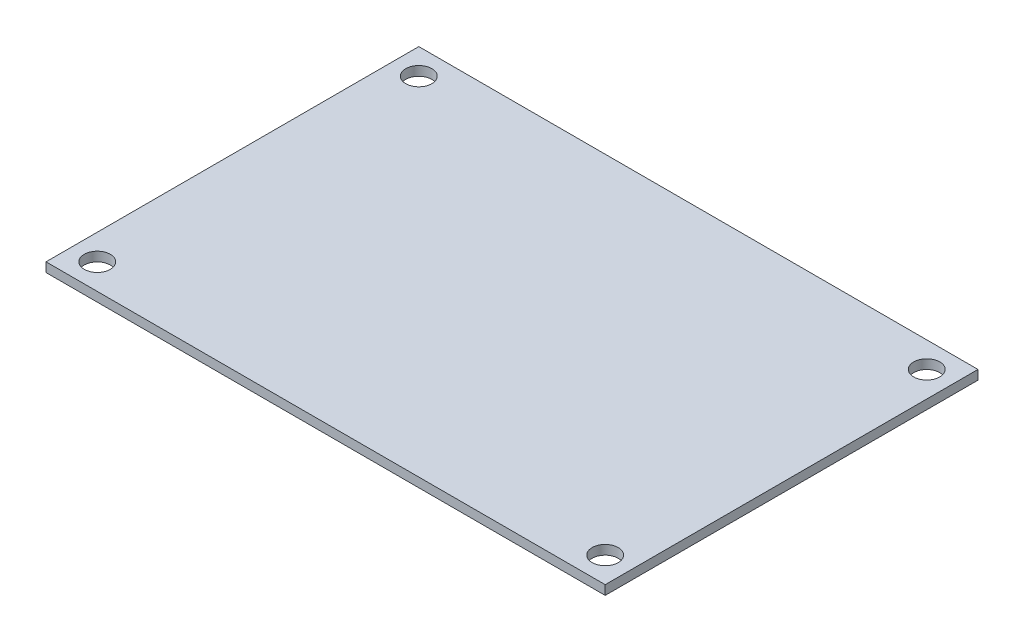
ISO-10303-21;
HEADER;
FILE_DESCRIPTION(('STEP AP214'),'2;1');
FILE_NAME('part.step','',(''),(''),'','','');
FILE_SCHEMA(('AUTOMOTIVE_DESIGN { 1 0 10303 214 1 1 1 1 }'));
ENDSEC;
DATA;
#1=APPLICATION_CONTEXT('core data for automotive mechanical design processes');
#2=APPLICATION_PROTOCOL_DEFINITION('international standard','automotive_design',2000,#1);
#3=PRODUCT_CONTEXT('',#1,'mechanical');
#4=PRODUCT('Part','Part','',(#3));
#5=PRODUCT_RELATED_PRODUCT_CATEGORY('part','',(#4));
#6=PRODUCT_DEFINITION_FORMATION('','',#4);
#7=PRODUCT_DEFINITION_CONTEXT('part definition',#1,'design');
#8=PRODUCT_DEFINITION('design','',#6,#7);
#9=PRODUCT_DEFINITION_SHAPE('','',#8);
#10=(LENGTH_UNIT() NAMED_UNIT(*) SI_UNIT(.MILLI.,.METRE.));
#11=(NAMED_UNIT(*) PLANE_ANGLE_UNIT() SI_UNIT($,.RADIAN.));
#12=(NAMED_UNIT(*) SI_UNIT($,.STERADIAN.) SOLID_ANGLE_UNIT());
#13=UNCERTAINTY_MEASURE_WITH_UNIT(LENGTH_MEASURE(1.E-05),#10,'distance_accuracy_value','');
#14=(GEOMETRIC_REPRESENTATION_CONTEXT(3) GLOBAL_UNCERTAINTY_ASSIGNED_CONTEXT((#13)) GLOBAL_UNIT_ASSIGNED_CONTEXT((#10,
#11,#12)) REPRESENTATION_CONTEXT('',''));
#15=CARTESIAN_POINT('',(0.,0.,0.));
#16=DIRECTION('',(0.,0.,1.));
#17=DIRECTION('',(1.,0.,0.));
#18=AXIS2_PLACEMENT_3D('',#15,#16,#17);
#19=CARTESIAN_POINT('',(0.,1.,0.));
#20=DIRECTION('',(1.,0.,0.));
#21=DIRECTION('',(0.,0.,-1.));
#22=AXIS2_PLACEMENT_3D('',#19,#20,#21);
#23=PLANE('',#22);
#24=DIRECTION('',(0.,0.,1.));
#25=VECTOR('',#24,1.);
#26=CARTESIAN_POINT('',(0.,0.,0.));
#27=LINE('',#26,#25);
#28=CARTESIAN_POINT('',(0.,0.,-40.));
#29=VERTEX_POINT('',#28);
#30=CARTESIAN_POINT('',(0.,0.,0.));
#31=VERTEX_POINT('',#30);
#32=EDGE_CURVE('E96',#29,#31,#27,.T.);
#33=ORIENTED_EDGE('',*,*,#32,.T.);
#34=DIRECTION('',(0.,-1.,0.));
#35=VECTOR('',#34,1.);
#36=CARTESIAN_POINT('',(0.,1.,0.));
#37=LINE('',#36,#35);
#38=CARTESIAN_POINT('',(0.,1.,0.));
#39=VERTEX_POINT('',#38);
#40=EDGE_CURVE('E11',#39,#31,#37,.T.);
#41=ORIENTED_EDGE('',*,*,#40,.F.);
#42=DIRECTION('',(0.,0.,1.));
#43=VECTOR('',#42,1.);
#44=CARTESIAN_POINT('',(0.,1.,0.));
#45=LINE('',#44,#43);
#46=CARTESIAN_POINT('',(0.,1.,-40.));
#47=VERTEX_POINT('',#46);
#48=EDGE_CURVE('E84',#47,#39,#45,.T.);
#49=ORIENTED_EDGE('',*,*,#48,.F.);
#50=DIRECTION('',(0.,-1.,0.));
#51=VECTOR('',#50,1.);
#52=CARTESIAN_POINT('',(0.,1.,-40.));
#53=LINE('',#52,#51);
#54=EDGE_CURVE('E92',#47,#29,#53,.T.);
#55=ORIENTED_EDGE('',*,*,#54,.T.);
#56=EDGE_LOOP('',(#33,#41,#49,#55));
#57=FACE_BOUND('',#56,.T.);
#58=ADVANCED_FACE('F33',(#57),#23,.F.);
#59=CARTESIAN_POINT('',(0.,1.,0.));
#60=DIRECTION('',(0.,0.,-1.));
#61=DIRECTION('',(-1.,0.,0.));
#62=AXIS2_PLACEMENT_3D('',#59,#60,#61);
#63=PLANE('',#62);
#64=DIRECTION('',(1.,0.,0.));
#65=VECTOR('',#64,1.);
#66=CARTESIAN_POINT('',(0.,0.,0.));
#67=LINE('',#66,#65);
#68=CARTESIAN_POINT('',(60.,0.,0.));
#69=VERTEX_POINT('',#68);
#70=EDGE_CURVE('E88',#31,#69,#67,.T.);
#71=ORIENTED_EDGE('',*,*,#70,.T.);
#72=DIRECTION('',(0.,-1.,0.));
#73=VECTOR('',#72,1.);
#74=CARTESIAN_POINT('',(60.,1.,0.));
#75=LINE('',#74,#73);
#76=CARTESIAN_POINT('',(60.,1.,0.));
#77=VERTEX_POINT('',#76);
#78=EDGE_CURVE('E41',#77,#69,#75,.T.);
#79=ORIENTED_EDGE('',*,*,#78,.F.);
#80=DIRECTION('',(1.,0.,0.));
#81=VECTOR('',#80,1.);
#82=CARTESIAN_POINT('',(0.,1.,0.));
#83=LINE('',#82,#81);
#84=EDGE_CURVE('E79',#39,#77,#83,.T.);
#85=ORIENTED_EDGE('',*,*,#84,.F.);
#86=ORIENTED_EDGE('',*,*,#40,.T.);
#87=EDGE_LOOP('',(#71,#79,#85,#86));
#88=FACE_BOUND('',#87,.T.);
#89=ADVANCED_FACE('F87',(#88),#63,.F.);
#90=CARTESIAN_POINT('',(60.,1.,0.));
#91=DIRECTION('',(-1.,0.,0.));
#92=DIRECTION('',(0.,0.,1.));
#93=AXIS2_PLACEMENT_3D('',#90,#91,#92);
#94=PLANE('',#93);
#95=DIRECTION('',(0.,0.,-1.));
#96=VECTOR('',#95,1.);
#97=CARTESIAN_POINT('',(60.,0.,0.));
#98=LINE('',#97,#96);
#99=CARTESIAN_POINT('',(60.,0.,-40.));
#100=VERTEX_POINT('',#99);
#101=EDGE_CURVE('E66',#69,#100,#98,.T.);
#102=ORIENTED_EDGE('',*,*,#101,.T.);
#103=DIRECTION('',(0.,-1.,0.));
#104=VECTOR('',#103,1.);
#105=CARTESIAN_POINT('',(60.,1.,-40.));
#106=LINE('',#105,#104);
#107=CARTESIAN_POINT('',(60.,1.,-40.));
#108=VERTEX_POINT('',#107);
#109=EDGE_CURVE('E89',#108,#100,#106,.T.);
#110=ORIENTED_EDGE('',*,*,#109,.F.);
#111=DIRECTION('',(0.,0.,-1.));
#112=VECTOR('',#111,1.);
#113=CARTESIAN_POINT('',(60.,1.,0.));
#114=LINE('',#113,#112);
#115=EDGE_CURVE('E82',#77,#108,#114,.T.);
#116=ORIENTED_EDGE('',*,*,#115,.F.);
#117=ORIENTED_EDGE('',*,*,#78,.T.);
#118=EDGE_LOOP('',(#102,#110,#116,#117));
#119=FACE_BOUND('',#118,.T.);
#120=ADVANCED_FACE('F90',(#119),#94,.F.);
#121=CARTESIAN_POINT('',(0.,1.,-40.));
#122=DIRECTION('',(0.,0.,1.));
#123=DIRECTION('',(1.,0.,0.));
#124=AXIS2_PLACEMENT_3D('',#121,#122,#123);
#125=PLANE('',#124);
#126=DIRECTION('',(-1.,0.,0.));
#127=VECTOR('',#126,1.);
#128=CARTESIAN_POINT('',(0.,0.,-40.));
#129=LINE('',#128,#127);
#130=EDGE_CURVE('E72',#100,#29,#129,.T.);
#131=ORIENTED_EDGE('',*,*,#130,.T.);
#132=ORIENTED_EDGE('',*,*,#54,.F.);
#133=DIRECTION('',(-1.,0.,0.));
#134=VECTOR('',#133,1.);
#135=CARTESIAN_POINT('',(0.,1.,-40.));
#136=LINE('',#135,#134);
#137=EDGE_CURVE('E49',#108,#47,#136,.T.);
#138=ORIENTED_EDGE('',*,*,#137,.F.);
#139=ORIENTED_EDGE('',*,*,#109,.T.);
#140=EDGE_LOOP('',(#131,#132,#138,#139));
#141=FACE_BOUND('',#140,.T.);
#142=ADVANCED_FACE('F104',(#141),#125,.F.);
#143=CARTESIAN_POINT('',(0.,1.,0.));
#144=DIRECTION('',(0.,-1.,0.));
#145=DIRECTION('',(0.,0.,-1.));
#146=AXIS2_PLACEMENT_3D('',#143,#144,#145);
#147=PLANE('',#146);
#148=CARTESIAN_POINT('',(2.75,1.,-2.75000000000001));
#149=DIRECTION('',(0.,1.,0.));
#150=DIRECTION('',(0.,0.,1.));
#151=AXIS2_PLACEMENT_3D('',#148,#149,#150);
#152=CIRCLE('',#151,1.4);
#153=CARTESIAN_POINT('',(2.75,1.,-1.35000000000001));
#154=VERTEX_POINT('',#153);
#155=EDGE_CURVE('E116',#154,#154,#152,.T.);
#156=ORIENTED_EDGE('',*,*,#155,.F.);
#157=EDGE_LOOP('',(#156));
#158=FACE_BOUND('',#157,.T.);
#159=CARTESIAN_POINT('',(57.25,1.,-2.75000000000001));
#160=DIRECTION('',(0.,1.,0.));
#161=DIRECTION('',(0.,0.,1.));
#162=AXIS2_PLACEMENT_3D('',#159,#160,#161);
#163=CIRCLE('',#162,1.4);
#164=CARTESIAN_POINT('',(57.25,1.,-1.35000000000001));
#165=VERTEX_POINT('',#164);
#166=EDGE_CURVE('E122',#165,#165,#163,.T.);
#167=ORIENTED_EDGE('',*,*,#166,.F.);
#168=EDGE_LOOP('',(#167));
#169=FACE_BOUND('',#168,.T.);
#170=CARTESIAN_POINT('',(57.25,1.,-37.25));
#171=DIRECTION('',(0.,1.,0.));
#172=DIRECTION('',(0.,0.,1.));
#173=AXIS2_PLACEMENT_3D('',#170,#171,#172);
#174=CIRCLE('',#173,1.4);
#175=CARTESIAN_POINT('',(57.25,1.,-35.85));
#176=VERTEX_POINT('',#175);
#177=EDGE_CURVE('E128',#176,#176,#174,.T.);
#178=ORIENTED_EDGE('',*,*,#177,.F.);
#179=EDGE_LOOP('',(#178));
#180=FACE_BOUND('',#179,.T.);
#181=CARTESIAN_POINT('',(2.75,1.,-37.25));
#182=DIRECTION('',(0.,1.,0.));
#183=DIRECTION('',(0.,0.,1.));
#184=AXIS2_PLACEMENT_3D('',#181,#182,#183);
#185=CIRCLE('',#184,1.4);
#186=CARTESIAN_POINT('',(2.75,1.,-35.85));
#187=VERTEX_POINT('',#186);
#188=EDGE_CURVE('E110',#187,#187,#185,.T.);
#189=ORIENTED_EDGE('',*,*,#188,.F.);
#190=EDGE_LOOP('',(#189));
#191=FACE_BOUND('',#190,.T.);
#192=ORIENTED_EDGE('',*,*,#48,.T.);
#193=ORIENTED_EDGE('',*,*,#84,.T.);
#194=ORIENTED_EDGE('',*,*,#115,.T.);
#195=ORIENTED_EDGE('',*,*,#137,.T.);
#196=EDGE_LOOP('',(#192,#193,#194,#195));
#197=FACE_BOUND('',#196,.T.);
#198=ADVANCED_FACE('F80',(#158,#169,#180,#191,#197),#147,.F.);
#199=CARTESIAN_POINT('',(0.,0.,0.));
#200=DIRECTION('',(0.,-1.,0.));
#201=DIRECTION('',(0.,0.,-1.));
#202=AXIS2_PLACEMENT_3D('',#199,#200,#201);
#203=PLANE('',#202);
#204=CARTESIAN_POINT('',(2.75,0.,-2.75000000000001));
#205=DIRECTION('',(0.,1.,0.));
#206=DIRECTION('',(0.,0.,1.));
#207=AXIS2_PLACEMENT_3D('',#204,#205,#206);
#208=CIRCLE('',#207,1.4);
#209=CARTESIAN_POINT('',(2.75,0.,-1.35000000000001));
#210=VERTEX_POINT('',#209);
#211=EDGE_CURVE('E119',#210,#210,#208,.T.);
#212=ORIENTED_EDGE('',*,*,#211,.T.);
#213=EDGE_LOOP('',(#212));
#214=FACE_BOUND('',#213,.T.);
#215=CARTESIAN_POINT('',(57.25,0.,-2.75000000000001));
#216=DIRECTION('',(0.,1.,0.));
#217=DIRECTION('',(0.,0.,1.));
#218=AXIS2_PLACEMENT_3D('',#215,#216,#217);
#219=CIRCLE('',#218,1.4);
#220=CARTESIAN_POINT('',(57.25,0.,-1.35000000000001));
#221=VERTEX_POINT('',#220);
#222=EDGE_CURVE('E125',#221,#221,#219,.T.);
#223=ORIENTED_EDGE('',*,*,#222,.T.);
#224=EDGE_LOOP('',(#223));
#225=FACE_BOUND('',#224,.T.);
#226=CARTESIAN_POINT('',(57.25,0.,-37.25));
#227=DIRECTION('',(0.,1.,0.));
#228=DIRECTION('',(0.,0.,1.));
#229=AXIS2_PLACEMENT_3D('',#226,#227,#228);
#230=CIRCLE('',#229,1.4);
#231=CARTESIAN_POINT('',(57.25,0.,-35.85));
#232=VERTEX_POINT('',#231);
#233=EDGE_CURVE('E113',#232,#232,#230,.T.);
#234=ORIENTED_EDGE('',*,*,#233,.T.);
#235=EDGE_LOOP('',(#234));
#236=FACE_BOUND('',#235,.T.);
#237=CARTESIAN_POINT('',(2.75,0.,-37.25));
#238=DIRECTION('',(0.,1.,0.));
#239=DIRECTION('',(0.,0.,1.));
#240=AXIS2_PLACEMENT_3D('',#237,#238,#239);
#241=CIRCLE('',#240,1.4);
#242=CARTESIAN_POINT('',(2.75,0.,-35.85));
#243=VERTEX_POINT('',#242);
#244=EDGE_CURVE('E99',#243,#243,#241,.T.);
#245=ORIENTED_EDGE('',*,*,#244,.T.);
#246=EDGE_LOOP('',(#245));
#247=FACE_BOUND('',#246,.T.);
#248=ORIENTED_EDGE('',*,*,#32,.F.);
#249=ORIENTED_EDGE('',*,*,#130,.F.);
#250=ORIENTED_EDGE('',*,*,#101,.F.);
#251=ORIENTED_EDGE('',*,*,#70,.F.);
#252=EDGE_LOOP('',(#248,#249,#250,#251));
#253=FACE_BOUND('',#252,.T.);
#254=ADVANCED_FACE('F107',(#214,#225,#236,#247,#253),#203,.T.);
#255=CARTESIAN_POINT('',(2.75,0.,-37.25));
#256=DIRECTION('',(0.,1.,0.));
#257=DIRECTION('',(0.,0.,1.));
#258=AXIS2_PLACEMENT_3D('',#255,#256,#257);
#259=CYLINDRICAL_SURFACE('',#258,1.4);
#260=ORIENTED_EDGE('',*,*,#244,.F.);
#261=EDGE_LOOP('',(#260));
#262=FACE_BOUND('',#261,.T.);
#263=ORIENTED_EDGE('',*,*,#188,.T.);
#264=EDGE_LOOP('',(#263));
#265=FACE_BOUND('',#264,.T.);
#266=ADVANCED_FACE('F140',(#262,#265),#259,.F.);
#267=CARTESIAN_POINT('',(57.25,0.,-37.25));
#268=DIRECTION('',(0.,1.,0.));
#269=DIRECTION('',(0.,0.,1.));
#270=AXIS2_PLACEMENT_3D('',#267,#268,#269);
#271=CYLINDRICAL_SURFACE('',#270,1.4);
#272=ORIENTED_EDGE('',*,*,#233,.F.);
#273=EDGE_LOOP('',(#272));
#274=FACE_BOUND('',#273,.T.);
#275=ORIENTED_EDGE('',*,*,#177,.T.);
#276=EDGE_LOOP('',(#275));
#277=FACE_BOUND('',#276,.T.);
#278=ADVANCED_FACE('F136',(#274,#277),#271,.F.);
#279=CARTESIAN_POINT('',(57.25,0.,-2.75000000000001));
#280=DIRECTION('',(0.,1.,0.));
#281=DIRECTION('',(0.,0.,1.));
#282=AXIS2_PLACEMENT_3D('',#279,#280,#281);
#283=CYLINDRICAL_SURFACE('',#282,1.4);
#284=ORIENTED_EDGE('',*,*,#222,.F.);
#285=EDGE_LOOP('',(#284));
#286=FACE_BOUND('',#285,.T.);
#287=ORIENTED_EDGE('',*,*,#166,.T.);
#288=EDGE_LOOP('',(#287));
#289=FACE_BOUND('',#288,.T.);
#290=ADVANCED_FACE('F139',(#286,#289),#283,.F.);
#291=CARTESIAN_POINT('',(2.75,0.,-2.75000000000001));
#292=DIRECTION('',(0.,1.,0.));
#293=DIRECTION('',(0.,0.,1.));
#294=AXIS2_PLACEMENT_3D('',#291,#292,#293);
#295=CYLINDRICAL_SURFACE('',#294,1.4);
#296=ORIENTED_EDGE('',*,*,#211,.F.);
#297=EDGE_LOOP('',(#296));
#298=FACE_BOUND('',#297,.T.);
#299=ORIENTED_EDGE('',*,*,#155,.T.);
#300=EDGE_LOOP('',(#299));
#301=FACE_BOUND('',#300,.T.);
#302=ADVANCED_FACE('F201',(#298,#301),#295,.F.);
#303=CLOSED_SHELL('',(#58,#89,#120,#142,#198,#254,#266,#278,#290,#302));
#304=MANIFOLD_SOLID_BREP('B2',#303);
#305=ADVANCED_BREP_SHAPE_REPRESENTATION('',(#18,#304),#14);
#306=SHAPE_DEFINITION_REPRESENTATION(#9,#305);
ENDSEC;
END-ISO-10303-21;
